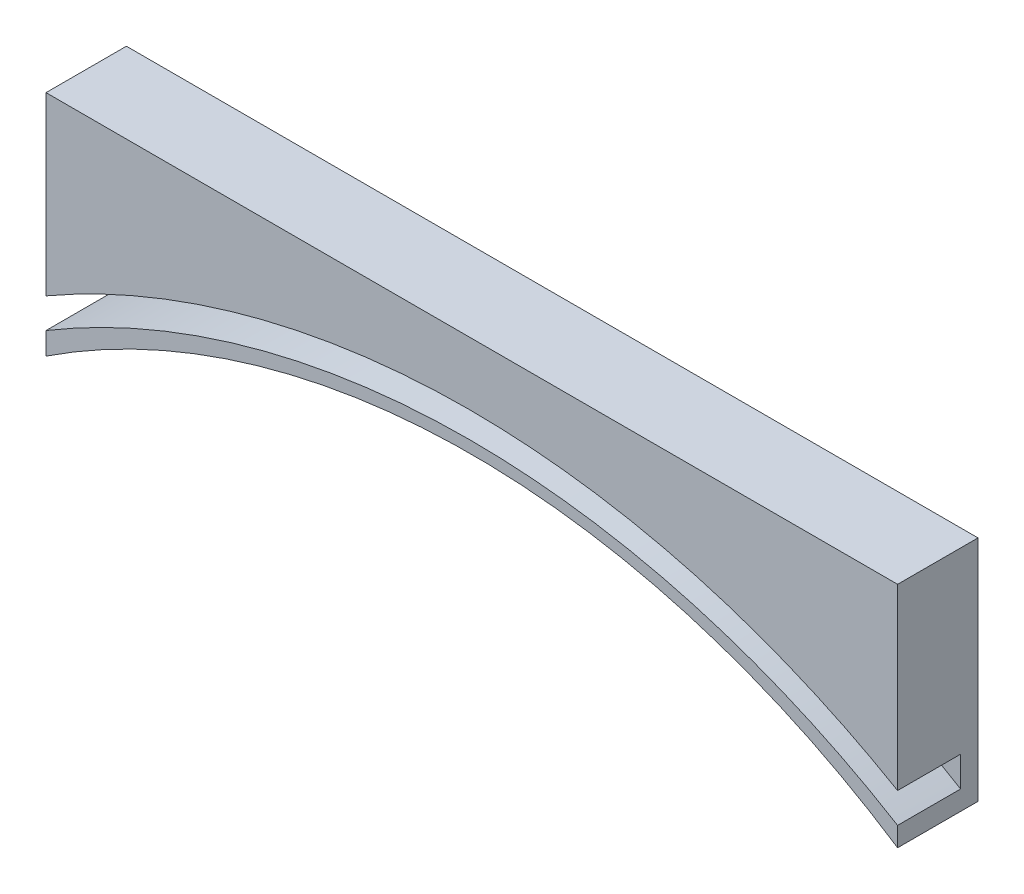
ISO-10303-21;
HEADER;
FILE_DESCRIPTION(('STEP AP214'),'2;1');
FILE_NAME('part.step','',(''),(''),'','','');
FILE_SCHEMA(('AUTOMOTIVE_DESIGN { 1 0 10303 214 1 1 1 1 }'));
ENDSEC;
DATA;
#1=APPLICATION_CONTEXT('core data for automotive mechanical design processes');
#2=APPLICATION_PROTOCOL_DEFINITION('international standard','automotive_design',2000,#1);
#3=PRODUCT_CONTEXT('',#1,'mechanical');
#4=PRODUCT('Part','Part','',(#3));
#5=PRODUCT_RELATED_PRODUCT_CATEGORY('part','',(#4));
#6=PRODUCT_DEFINITION_FORMATION('','',#4);
#7=PRODUCT_DEFINITION_CONTEXT('part definition',#1,'design');
#8=PRODUCT_DEFINITION('design','',#6,#7);
#9=PRODUCT_DEFINITION_SHAPE('','',#8);
#10=(LENGTH_UNIT() NAMED_UNIT(*) SI_UNIT(.MILLI.,.METRE.));
#11=(NAMED_UNIT(*) PLANE_ANGLE_UNIT() SI_UNIT($,.RADIAN.));
#12=(NAMED_UNIT(*) SI_UNIT($,.STERADIAN.) SOLID_ANGLE_UNIT());
#13=UNCERTAINTY_MEASURE_WITH_UNIT(LENGTH_MEASURE(1.E-05),#10,'distance_accuracy_value','');
#14=(GEOMETRIC_REPRESENTATION_CONTEXT(3) GLOBAL_UNCERTAINTY_ASSIGNED_CONTEXT((#13)) GLOBAL_UNIT_ASSIGNED_CONTEXT((#10,
#11,#12)) REPRESENTATION_CONTEXT('',''));
#15=CARTESIAN_POINT('',(0.,0.,0.));
#16=DIRECTION('',(0.,0.,1.));
#17=DIRECTION('',(1.,0.,0.));
#18=AXIS2_PLACEMENT_3D('',#15,#16,#17);
#19=CARTESIAN_POINT('',(0.,0.,16.));
#20=DIRECTION('',(0.,0.,-1.));
#21=DIRECTION('',(-1.,0.,0.));
#22=AXIS2_PLACEMENT_3D('',#19,#20,#21);
#23=PLANE('',#22);
#24=CARTESIAN_POINT('',(82.7397911109106,-124.333714197072,16.002903079481));
#25=CARTESIAN_POINT('',(82.3755164084784,-124.117363235297,16.002903079481));
#26=CARTESIAN_POINT('',(82.0018327999817,-123.896841508316,16.0029030794832));
#27=CARTESIAN_POINT('',(68.6213010314857,-116.090106708364,16.0029030794038));
#28=CARTESIAN_POINT('',(54.2566697477969,-110.065617593653,16.0029030794813));
#29=CARTESIAN_POINT('',(24.0296779465722,-102.175579117723,16.0029030794813));
#30=CARTESIAN_POINT('',(8.21085486277685,-100.312946686678,16.0029030794819));
#31=CARTESIAN_POINT('',(-23.2222044888509,-101.051424681224,16.0029030794819));
#32=CARTESIAN_POINT('',(-38.7982289385683,-103.637289837195,16.0029030795092));
#33=CARTESIAN_POINT('',(-60.8099606073978,-110.444286670569,16.0029030794699));
#34=CARTESIAN_POINT('',(-67.9191228027658,-113.18910098956,16.0029030794836));
#35=CARTESIAN_POINT('',(-81.5489054987576,-119.52157367615,16.0029030794836));
#36=CARTESIAN_POINT('',(-88.0575222460823,-123.118344791084,16.0029030794967));
#37=CARTESIAN_POINT('',(-94.2179272228485,-127.000728785435,16.0029030794842));
#38=B_SPLINE_CURVE_WITH_KNOTS('',3,(#24,#25,#26,#27,#28,#29,#30,#31,#32,#33,#34,#35,#36,#37),
.UNSPECIFIED.,.F.,.F.,(4,2,2,2,2,2,4),(0.,0.00683637442183873,0.255127280816379,
0.503418187210919,0.75170909360546,0.87585454680273,1.),.UNSPECIFIED.);
#39=CARTESIAN_POINT('',(81.6432889200797,-123.687662359794,16.0014515397465));
#40=VERTEX_POINT('',#39);
#41=CARTESIAN_POINT('',(-87.8567110799016,-123.169281222685,16.0011965057749));
#42=VERTEX_POINT('',#41);
#43=EDGE_CURVE('E176',#40,#42,#38,.T.);
#44=ORIENTED_EDGE('',*,*,#43,.F.);
#45=DIRECTION('',(0.,1.,0.));
#46=VECTOR('',#45,1.);
#47=CARTESIAN_POINT('',(81.6432889200797,-98.1371131385497,16.));
#48=LINE('',#47,#46);
#49=CARTESIAN_POINT('',(81.6432889200797,-88.1371131385497,16.));
#50=VERTEX_POINT('',#49);
#51=EDGE_CURVE('E115',#50,#40,#48,.F.);
#52=ORIENTED_EDGE('',*,*,#51,.F.);
#53=DIRECTION('',(1.,0.,0.));
#54=VECTOR('',#53,1.);
#55=CARTESIAN_POINT('',(-87.8567110799203,-88.1371131385497,16.));
#56=LINE('',#55,#54);
#57=CARTESIAN_POINT('',(-87.8567110799203,-88.1371131385497,16.));
#58=VERTEX_POINT('',#57);
#59=EDGE_CURVE('E118',#58,#50,#56,.T.);
#60=ORIENTED_EDGE('',*,*,#59,.F.);
#61=DIRECTION('',(0.,1.,0.));
#62=VECTOR('',#61,1.);
#63=CARTESIAN_POINT('',(-87.8567110799203,-98.1371131385497,15.9999999999999));
#64=LINE('',#63,#62);
#65=EDGE_CURVE('E52',#42,#58,#64,.T.);
#66=ORIENTED_EDGE('',*,*,#65,.F.);
#67=EDGE_LOOP('',(#44,#52,#60,#66));
#68=FACE_BOUND('',#67,.T.);
#69=ADVANCED_FACE('F41',(#68),#23,.F.);
#70=DIRECTION('',(0.,1.,0.));
#71=VECTOR('',#70,1.);
#72=CARTESIAN_POINT('',(81.6432889200797,-98.1371131385497,16.));
#73=LINE('',#72,#71);
#74=CARTESIAN_POINT('',(81.643288919573,-129.687642387889,16.0011950243792));
#75=VERTEX_POINT('',#74);
#76=CARTESIAN_POINT('',(81.6432889200797,-133.554697933359,16.));
#77=VERTEX_POINT('',#76);
#78=EDGE_CURVE('E157',#75,#77,#73,.F.);
#79=ORIENTED_EDGE('',*,*,#78,.F.);
#80=CARTESIAN_POINT('',(82.6962099718894,-130.333555918678,16.002903079481));
#81=CARTESIAN_POINT('',(82.3464719936446,-130.117236358512,16.002903079481));
#82=CARTESIAN_POINT('',(81.9866255242221,-129.896841506799,16.0029030794796));
#83=CARTESIAN_POINT('',(69.1736154673486,-122.090106763448,16.0029030795325));
#84=CARTESIAN_POINT('',(55.3321985254833,-115.995213643004,16.0029030794808));
#85=CARTESIAN_POINT('',(26.1893467667422,-107.801652521192,16.0029030794808));
#86=CARTESIAN_POINT('',(10.8735078417722,-105.719561422908,16.0029030794802));
#87=CARTESIAN_POINT('',(-19.5942812305018,-105.863843686113,16.0029030794802));
#88=CARTESIAN_POINT('',(-34.7499351591748,-108.099853972977,16.0029030795054));
#89=CARTESIAN_POINT('',(-56.2032333443861,-114.298356521092,16.002903079466));
#90=CARTESIAN_POINT('',(-63.1487154455918,-116.838422053478,16.0029030794657));
#91=CARTESIAN_POINT('',(-76.4671950944512,-122.723221566616,16.0029030794913));
#92=CARTESIAN_POINT('',(-82.8399146507995,-126.093721607834,16.0029030794903));
#93=CARTESIAN_POINT('',(-88.8939086785165,-129.767464504583,16.0029030794779));
#94=B_SPLINE_CURVE_WITH_KNOTS('',3,(#80,#81,#82,#83,#84,#85,#86,#87,#88,#89,#90,#91,#92,#93),
.UNSPECIFIED.,.F.,.F.,(4,2,2,2,2,2,4),(0.,0.00683637442183873,0.255127280816379,
0.503418187210919,0.75170909360546,0.87585454680273,1.),.UNSPECIFIED.);
#95=CARTESIAN_POINT('',(-87.8567110799203,-129.142909702766,16.00145153964));
#96=VERTEX_POINT('',#95);
#97=EDGE_CURVE('E166',#75,#96,#94,.T.);
#98=ORIENTED_EDGE('',*,*,#97,.T.);
#99=DIRECTION('',(0.,1.,0.));
#100=VECTOR('',#99,1.);
#101=CARTESIAN_POINT('',(-87.8567110799203,-98.1371131385497,15.9999999999999));
#102=LINE('',#101,#100);
#103=CARTESIAN_POINT('',(-87.8567110799203,-133.554697933359,15.9999999999999));
#104=VERTEX_POINT('',#103);
#105=EDGE_CURVE('E12',#104,#96,#102,.T.);
#106=ORIENTED_EDGE('',*,*,#105,.F.);
#107=CARTESIAN_POINT('',(-3.10671107992024,-262.13711313855,16.));
#108=DIRECTION('',(0.,0.,-1.));
#109=DIRECTION('',(-1.,0.,0.));
#110=AXIS2_PLACEMENT_3D('',#107,#108,#109);
#111=CIRCLE('',#110,154.);
#112=EDGE_CURVE('E155',#77,#104,#111,.F.);
#113=ORIENTED_EDGE('',*,*,#112,.F.);
#114=EDGE_LOOP('',(#79,#98,#106,#113));
#115=FACE_BOUND('',#114,.T.);
#116=ADVANCED_FACE('F43',(#115),#23,.F.);
#117=CARTESIAN_POINT('',(0.,0.,0.));
#118=DIRECTION('',(0.,0.,1.));
#119=DIRECTION('',(1.,0.,0.));
#120=AXIS2_PLACEMENT_3D('',#117,#118,#119);
#121=PLANE('',#120);
#122=DIRECTION('',(0.,1.,0.));
#123=VECTOR('',#122,1.);
#124=CARTESIAN_POINT('',(81.6432889200797,-98.1371131385497,0.));
#125=LINE('',#124,#123);
#126=CARTESIAN_POINT('',(81.6432889200797,-133.554697933359,0.));
#127=VERTEX_POINT('',#126);
#128=CARTESIAN_POINT('',(81.6432889200797,-88.1371131385497,0.));
#129=VERTEX_POINT('',#128);
#130=EDGE_CURVE('E152',#127,#129,#125,.T.);
#131=ORIENTED_EDGE('',*,*,#130,.F.);
#132=CARTESIAN_POINT('',(-3.10671107992024,-262.13711313855,0.));
#133=DIRECTION('',(0.,0.,1.));
#134=DIRECTION('',(1.,0.,0.));
#135=AXIS2_PLACEMENT_3D('',#132,#133,#134);
#136=CIRCLE('',#135,154.);
#137=CARTESIAN_POINT('',(-87.8567110799202,-133.554697933359,0.));
#138=VERTEX_POINT('',#137);
#139=EDGE_CURVE('E146',#138,#127,#136,.F.);
#140=ORIENTED_EDGE('',*,*,#139,.F.);
#141=DIRECTION('',(0.,-1.,0.));
#142=VECTOR('',#141,1.);
#143=CARTESIAN_POINT('',(-87.8567110799203,-98.1371131385497,0.));
#144=LINE('',#143,#142);
#145=CARTESIAN_POINT('',(-87.8567110799203,-88.1371131385497,0.));
#146=VERTEX_POINT('',#145);
#147=EDGE_CURVE('E150',#146,#138,#144,.T.);
#148=ORIENTED_EDGE('',*,*,#147,.F.);
#149=DIRECTION('',(-1.,0.,0.));
#150=VECTOR('',#149,1.);
#151=CARTESIAN_POINT('',(-87.8567110799203,-88.1371131385497,0.));
#152=LINE('',#151,#150);
#153=EDGE_CURVE('E128',#129,#146,#152,.T.);
#154=ORIENTED_EDGE('',*,*,#153,.F.);
#155=EDGE_LOOP('',(#131,#140,#148,#154));
#156=FACE_BOUND('',#155,.T.);
#157=ADVANCED_FACE('F229',(#156),#121,.F.);
#158=CARTESIAN_POINT('',(-87.8567110799203,-98.1371131385497,32.));
#159=DIRECTION('',(1.,0.,0.));
#160=DIRECTION('',(0.,1.,0.));
#161=AXIS2_PLACEMENT_3D('',#158,#159,#160);
#162=PLANE('',#161);
#163=DIRECTION('',(0.,-1.,-1.98370607513062E-12));
#164=VECTOR('',#163,1.);
#165=CARTESIAN_POINT('',(-87.8567110799203,-130.333555918678,3.46290307927768));
#166=LINE('',#165,#164);
#167=CARTESIAN_POINT('',(-87.8567110799203,-129.142908170963,3.46290307928005));
#168=VERTEX_POINT('',#167);
#169=CARTESIAN_POINT('',(-87.856711079882,-123.169267995206,3.46290307934264));
#170=VERTEX_POINT('',#169);
#171=EDGE_CURVE('E141',#168,#170,#166,.F.);
#172=ORIENTED_EDGE('',*,*,#171,.T.);
#173=DIRECTION('',(0.,0.,1.));
#174=VECTOR('',#173,1.);
#175=CARTESIAN_POINT('',(-87.8567110799203,-123.169291290547,9.73290307949224));
#176=LINE('',#175,#174);
#177=EDGE_CURVE('E112',#170,#42,#176,.T.);
#178=ORIENTED_EDGE('',*,*,#177,.T.);
#179=ORIENTED_EDGE('',*,*,#65,.T.);
#180=DIRECTION('',(0.,0.,1.));
#181=VECTOR('',#180,1.);
#182=CARTESIAN_POINT('',(-87.8567110799203,-88.1371131385497,0.));
#183=LINE('',#182,#181);
#184=EDGE_CURVE('E111',#146,#58,#183,.T.);
#185=ORIENTED_EDGE('',*,*,#184,.F.);
#186=ORIENTED_EDGE('',*,*,#147,.T.);
#187=DIRECTION('',(0.,0.,1.));
#188=VECTOR('',#187,1.);
#189=CARTESIAN_POINT('',(-87.8567110799203,-133.554697933359,-435.577777210913));
#190=LINE('',#189,#188);
#191=EDGE_CURVE('E153',#138,#104,#190,.T.);
#192=ORIENTED_EDGE('',*,*,#191,.T.);
#193=ORIENTED_EDGE('',*,*,#105,.T.);
#194=DIRECTION('',(0.,0.,-1.));
#195=VECTOR('',#194,1.);
#196=CARTESIAN_POINT('',(-87.8567110799203,-129.142912059641,9.73290307947997));
#197=LINE('',#196,#195);
#198=EDGE_CURVE('E140',#96,#168,#197,.T.);
#199=ORIENTED_EDGE('',*,*,#198,.T.);
#200=EDGE_LOOP('',(#172,#178,#179,#185,#186,#192,#193,#199));
#201=FACE_BOUND('',#200,.T.);
#202=ADVANCED_FACE('F108',(#201),#162,.F.);
#203=CARTESIAN_POINT('',(81.6432889200797,-98.1371131385497,32.));
#204=DIRECTION('',(-1.,0.,0.));
#205=DIRECTION('',(0.,0.,1.));
#206=AXIS2_PLACEMENT_3D('',#203,#204,#205);
#207=PLANE('',#206);
#208=ORIENTED_EDGE('',*,*,#51,.T.);
#209=DIRECTION('',(0.,0.,1.));
#210=VECTOR('',#209,1.);
#211=CARTESIAN_POINT('',(81.6432889200792,-123.68765273817,9.73290307948105));
#212=LINE('',#211,#210);
#213=CARTESIAN_POINT('',(81.6432889200795,-123.687659651613,3.46290307948701));
#214=VERTEX_POINT('',#213);
#215=EDGE_CURVE('E311',#40,#214,#212,.F.);
#216=ORIENTED_EDGE('',*,*,#215,.T.);
#217=DIRECTION('',(0.,1.,1.98370607513062E-12));
#218=VECTOR('',#217,1.);
#219=CARTESIAN_POINT('',(81.6432889200797,-130.333555918678,3.46290307947979));
#220=LINE('',#219,#218);
#221=CARTESIAN_POINT('',(81.6432889194299,-129.68763762953,3.46290307948106));
#222=VERTEX_POINT('',#221);
#223=EDGE_CURVE('E306',#214,#222,#220,.F.);
#224=ORIENTED_EDGE('',*,*,#223,.T.);
#225=DIRECTION('',(0.,0.,-1.));
#226=VECTOR('',#225,1.);
#227=CARTESIAN_POINT('',(81.6432889200798,-129.68765273817,9.73290307948105));
#228=LINE('',#227,#226);
#229=EDGE_CURVE('E302',#222,#75,#228,.F.);
#230=ORIENTED_EDGE('',*,*,#229,.T.);
#231=ORIENTED_EDGE('',*,*,#78,.T.);
#232=DIRECTION('',(0.,0.,1.));
#233=VECTOR('',#232,1.);
#234=CARTESIAN_POINT('',(81.6432889200797,-133.554697933359,-435.577777210913));
#235=LINE('',#234,#233);
#236=EDGE_CURVE('E149',#77,#127,#235,.F.);
#237=ORIENTED_EDGE('',*,*,#236,.T.);
#238=ORIENTED_EDGE('',*,*,#130,.T.);
#239=DIRECTION('',(0.,0.,-1.));
#240=VECTOR('',#239,1.);
#241=CARTESIAN_POINT('',(81.6432889200797,-88.1371131385497,0.));
#242=LINE('',#241,#240);
#243=EDGE_CURVE('E123',#50,#129,#242,.T.);
#244=ORIENTED_EDGE('',*,*,#243,.F.);
#245=EDGE_LOOP('',(#208,#216,#224,#230,#231,#237,#238,#244));
#246=FACE_BOUND('',#245,.T.);
#247=ADVANCED_FACE('F274',(#246),#207,.F.);
#248=CARTESIAN_POINT('',(-3.10671107992024,-262.13711313855,-435.577777210913));
#249=DIRECTION('',(0.,0.,1.));
#250=DIRECTION('',(1.,0.,0.));
#251=AXIS2_PLACEMENT_3D('',#248,#249,#250);
#252=CYLINDRICAL_SURFACE('',#251,154.);
#253=ORIENTED_EDGE('',*,*,#236,.F.);
#254=ORIENTED_EDGE('',*,*,#112,.T.);
#255=ORIENTED_EDGE('',*,*,#191,.F.);
#256=ORIENTED_EDGE('',*,*,#139,.T.);
#257=EDGE_LOOP('',(#253,#254,#255,#256));
#258=FACE_BOUND('',#257,.T.);
#259=ADVANCED_FACE('F228',(#258),#252,.F.);
#260=CARTESIAN_POINT('',(82.6962099718894,-130.333555918678,3.46290307948104));
#261=DIRECTION('',(1.19235148299765E-12,1.98370607513062E-12,-1.));
#262=DIRECTION('',(0.,1.,1.98370607513062E-12));
#263=AXIS2_PLACEMENT_3D('',#260,#261,#262);
#264=PLANE('',#263);
#265=CARTESIAN_POINT('',(82.6962099718894,-130.333555918678,3.46290307948104));
#266=CARTESIAN_POINT('',(82.3464719936526,-130.117236358517,3.46290307948104));
#267=CARTESIAN_POINT('',(81.9866255242108,-129.896841506793,3.46290307947963));
#268=CARTESIAN_POINT('',(69.1736154677605,-122.090106763654,3.46290307953253));
#269=CARTESIAN_POINT('',(55.3321985254836,-115.995213643003,3.46290307948417));
#270=CARTESIAN_POINT('',(26.1893467667425,-107.801652521191,3.4629030794775));
#271=CARTESIAN_POINT('',(10.8735078417721,-105.719561422904,3.46290307948688));
#272=CARTESIAN_POINT('',(-19.5942812305018,-105.863843686109,3.46290307947346));
#273=CARTESIAN_POINT('',(-34.7499351591775,-108.099853972968,3.46290307948897));
#274=CARTESIAN_POINT('',(-56.2032333443888,-114.298356521083,3.46290307947421));
#275=CARTESIAN_POINT('',(-63.148715445597,-116.838422053466,3.46290307947049));
#276=CARTESIAN_POINT('',(-76.4671950944563,-122.723221566604,3.46290307948653));
#277=CARTESIAN_POINT('',(-82.8399146506748,-126.093721608039,3.46290307949188));
#278=CARTESIAN_POINT('',(-88.8939086785247,-129.76746450457,3.46290307947786));
#279=B_SPLINE_CURVE_WITH_KNOTS('',3,(#265,#266,#267,#268,#269,#270,#271,#272,#273,#274,#275,
#276,#277,#278),.UNSPECIFIED.,.F.,.F.,(4,2,2,2,2,2,4),(0.,0.00683637442183873,0.255127280816379,
0.503418187210919,0.75170909360546,0.87585454680273,1.),.UNSPECIFIED.);
#280=EDGE_CURVE('E61',#222,#168,#279,.T.);
#281=ORIENTED_EDGE('',*,*,#280,.F.);
#282=ORIENTED_EDGE('',*,*,#223,.F.);
#283=CARTESIAN_POINT('',(82.7397911109106,-124.333714197072,3.46290307948104));
#284=CARTESIAN_POINT('',(82.3755164084866,-124.117363235302,3.46290307948104));
#285=CARTESIAN_POINT('',(82.0018327999704,-123.89684150831,3.46290307948317));
#286=CARTESIAN_POINT('',(68.6213010318975,-116.09010670857,3.46290307940383));
#287=CARTESIAN_POINT('',(54.2566697477971,-110.065617593652,3.46290307948462));
#288=CARTESIAN_POINT('',(24.0296779465725,-102.175579117722,3.46290307947795));
#289=CARTESIAN_POINT('',(8.2108548627768,-100.312946686673,3.46290307948866));
#290=CARTESIAN_POINT('',(-23.222204488851,-101.051424681219,3.46290307947524));
#291=CARTESIAN_POINT('',(-38.7982289385709,-103.637289837186,3.46290307948954));
#292=CARTESIAN_POINT('',(-60.8099606074004,-110.44428667056,3.4629030794797));
#293=CARTESIAN_POINT('',(-67.9191228027709,-113.189100989549,3.46290307947557));
#294=CARTESIAN_POINT('',(-81.5489054987627,-119.521573676139,3.46290307949161));
#295=CARTESIAN_POINT('',(-88.0575222460453,-123.118344791142,3.46290307950447));
#296=CARTESIAN_POINT('',(-94.2179272228566,-127.000728785422,3.46290307948423));
#297=B_SPLINE_CURVE_WITH_KNOTS('',3,(#283,#284,#285,#286,#287,#288,#289,#290,#291,#292,#293,
#294,#295,#296),.UNSPECIFIED.,.F.,.F.,(4,2,2,2,2,2,4),(0.,0.00683637442183873,0.255127280816379,
0.503418187210919,0.75170909360546,0.87585454680273,1.),.UNSPECIFIED.);
#298=EDGE_CURVE('E187',#214,#170,#297,.T.);
#299=ORIENTED_EDGE('',*,*,#298,.T.);
#300=ORIENTED_EDGE('',*,*,#171,.F.);
#301=EDGE_LOOP('',(#281,#282,#299,#300));
#302=FACE_BOUND('',#301,.T.);
#303=ADVANCED_FACE('F217',(#302),#264,.F.);
#304=CARTESIAN_POINT('',(82.7397911109106,-124.333714197072,3.46290307948104));
#305=CARTESIAN_POINT('',(82.3755164084866,-124.117363235302,3.46290307948104));
#306=CARTESIAN_POINT('',(82.0018327999704,-123.89684150831,3.46290307948317));
#307=CARTESIAN_POINT('',(68.6213010318975,-116.09010670857,3.46290307940383));
#308=CARTESIAN_POINT('',(54.2566697477971,-110.065617593652,3.46290307948462));
#309=CARTESIAN_POINT('',(24.0296779465725,-102.175579117722,3.46290307947795));
#310=CARTESIAN_POINT('',(8.2108548627768,-100.312946686673,3.46290307948866));
#311=CARTESIAN_POINT('',(-23.222204488851,-101.051424681219,3.46290307947524));
#312=CARTESIAN_POINT('',(-38.7982289385709,-103.637289837186,3.46290307948954));
#313=CARTESIAN_POINT('',(-60.8099606074004,-110.44428667056,3.4629030794797));
#314=CARTESIAN_POINT('',(-67.9191228027709,-113.189100989549,3.46290307947557));
#315=CARTESIAN_POINT('',(-81.5489054987627,-119.521573676139,3.46290307949161));
#316=CARTESIAN_POINT('',(-88.0575222460453,-123.118344791142,3.46290307950447));
#317=CARTESIAN_POINT('',(-94.2179272228566,-127.000728785422,3.46290307948423));
#318=CARTESIAN_POINT('',(82.7397911109106,-124.333714197072,16.002903079481));
#319=CARTESIAN_POINT('',(82.3755164084784,-124.117363235297,16.002903079481));
#320=CARTESIAN_POINT('',(82.0018327999817,-123.896841508316,16.0029030794832));
#321=CARTESIAN_POINT('',(68.6213010314857,-116.090106708364,16.0029030794038));
#322=CARTESIAN_POINT('',(54.2566697477969,-110.065617593653,16.0029030794813));
#323=CARTESIAN_POINT('',(24.0296779465722,-102.175579117723,16.0029030794813));
#324=CARTESIAN_POINT('',(8.21085486277685,-100.312946686678,16.0029030794819));
#325=CARTESIAN_POINT('',(-23.2222044888509,-101.051424681224,16.0029030794819));
#326=CARTESIAN_POINT('',(-38.7982289385683,-103.637289837195,16.0029030795092));
#327=CARTESIAN_POINT('',(-60.8099606073978,-110.444286670569,16.0029030794699));
#328=CARTESIAN_POINT('',(-67.9191228027658,-113.18910098956,16.0029030794836));
#329=CARTESIAN_POINT('',(-81.5489054987576,-119.52157367615,16.0029030794836));
#330=CARTESIAN_POINT('',(-88.0575222460823,-123.118344791084,16.0029030794967));
#331=CARTESIAN_POINT('',(-94.2179272228485,-127.000728785435,16.0029030794842));
#332=B_SPLINE_SURFACE_WITH_KNOTS('',1,3,((#304,#305,#306,#307,#308,#309,#310,#311,#312,#313,
#314,#315,#316,#317),(#318,#319,#320,#321,#322,#323,#324,#325,#326,#327,#328,#329,#330,#331)),
.UNSPECIFIED.,.F.,.F.,.F.,(2,2),(4,2,2,2,2,2,4),(0.,1.),(0.,0.00683637442183873,
0.255127280816379,0.503418187210919,0.75170909360546,0.87585454680273,1.),.UNSPECIFIED.);
#333=ORIENTED_EDGE('',*,*,#298,.F.);
#334=ORIENTED_EDGE('',*,*,#215,.F.);
#335=ORIENTED_EDGE('',*,*,#43,.T.);
#336=ORIENTED_EDGE('',*,*,#177,.F.);
#337=EDGE_LOOP('',(#333,#334,#335,#336));
#338=FACE_BOUND('',#337,.T.);
#339=ADVANCED_FACE('F227',(#338),#332,.T.);
#340=CARTESIAN_POINT('',(82.6962099718894,-130.333555918678,16.002903079481));
#341=CARTESIAN_POINT('',(82.3464719936446,-130.117236358512,16.002903079481));
#342=CARTESIAN_POINT('',(81.9866255242221,-129.896841506799,16.0029030794796));
#343=CARTESIAN_POINT('',(69.1736154673486,-122.090106763448,16.0029030795325));
#344=CARTESIAN_POINT('',(55.3321985254833,-115.995213643004,16.0029030794808));
#345=CARTESIAN_POINT('',(26.1893467667422,-107.801652521192,16.0029030794808));
#346=CARTESIAN_POINT('',(10.8735078417722,-105.719561422908,16.0029030794802));
#347=CARTESIAN_POINT('',(-19.5942812305018,-105.863843686113,16.0029030794802));
#348=CARTESIAN_POINT('',(-34.7499351591748,-108.099853972977,16.0029030795054));
#349=CARTESIAN_POINT('',(-56.2032333443861,-114.298356521092,16.002903079466));
#350=CARTESIAN_POINT('',(-63.1487154455918,-116.838422053478,16.0029030794657));
#351=CARTESIAN_POINT('',(-76.4671950944512,-122.723221566616,16.0029030794913));
#352=CARTESIAN_POINT('',(-82.8399146507995,-126.093721607834,16.0029030794903));
#353=CARTESIAN_POINT('',(-88.8939086785165,-129.767464504583,16.0029030794779));
#354=CARTESIAN_POINT('',(82.6962099718894,-130.333555918678,3.46290307948104));
#355=CARTESIAN_POINT('',(82.3464719936526,-130.117236358517,3.46290307948104));
#356=CARTESIAN_POINT('',(81.9866255242108,-129.896841506793,3.46290307947963));
#357=CARTESIAN_POINT('',(69.1736154677605,-122.090106763654,3.46290307953253));
#358=CARTESIAN_POINT('',(55.3321985254836,-115.995213643003,3.46290307948417));
#359=CARTESIAN_POINT('',(26.1893467667425,-107.801652521191,3.4629030794775));
#360=CARTESIAN_POINT('',(10.8735078417721,-105.719561422904,3.46290307948688));
#361=CARTESIAN_POINT('',(-19.5942812305018,-105.863843686109,3.46290307947346));
#362=CARTESIAN_POINT('',(-34.7499351591775,-108.099853972968,3.46290307948897));
#363=CARTESIAN_POINT('',(-56.2032333443888,-114.298356521083,3.46290307947421));
#364=CARTESIAN_POINT('',(-63.148715445597,-116.838422053466,3.46290307947049));
#365=CARTESIAN_POINT('',(-76.4671950944563,-122.723221566604,3.46290307948653));
#366=CARTESIAN_POINT('',(-82.8399146506748,-126.093721608039,3.46290307949188));
#367=CARTESIAN_POINT('',(-88.8939086785247,-129.76746450457,3.46290307947786));
#368=B_SPLINE_SURFACE_WITH_KNOTS('',1,3,((#340,#341,#342,#343,#344,#345,#346,#347,#348,#349,
#350,#351,#352,#353),(#354,#355,#356,#357,#358,#359,#360,#361,#362,#363,#364,#365,#366,#367)),
.UNSPECIFIED.,.F.,.F.,.F.,(2,2),(4,2,2,2,2,2,4),(0.,1.),(0.,0.00683637442183873,
0.255127280816379,0.503418187210919,0.75170909360546,0.87585454680273,1.),.UNSPECIFIED.);
#369=ORIENTED_EDGE('',*,*,#97,.F.);
#370=ORIENTED_EDGE('',*,*,#229,.F.);
#371=ORIENTED_EDGE('',*,*,#280,.T.);
#372=ORIENTED_EDGE('',*,*,#198,.F.);
#373=EDGE_LOOP('',(#369,#370,#371,#372));
#374=FACE_BOUND('',#373,.T.);
#375=ADVANCED_FACE('F255',(#374),#368,.T.);
#376=CARTESIAN_POINT('',(0.,-88.1371131385497,0.));
#377=DIRECTION('',(0.,1.,0.));
#378=DIRECTION('',(0.,0.,1.));
#379=AXIS2_PLACEMENT_3D('',#376,#377,#378);
#380=PLANE('',#379);
#381=ORIENTED_EDGE('',*,*,#184,.T.);
#382=ORIENTED_EDGE('',*,*,#59,.T.);
#383=ORIENTED_EDGE('',*,*,#243,.T.);
#384=ORIENTED_EDGE('',*,*,#153,.T.);
#385=EDGE_LOOP('',(#381,#382,#383,#384));
#386=FACE_BOUND('',#385,.T.);
#387=ADVANCED_FACE('F126',(#386),#380,.T.);
#388=CLOSED_SHELL('',(#69,#116,#157,#202,#247,#259,#303,#339,#375,#387));
#389=MANIFOLD_SOLID_BREP('B2',#388);
#390=ADVANCED_BREP_SHAPE_REPRESENTATION('',(#18,#389),#14);
#391=SHAPE_DEFINITION_REPRESENTATION(#9,#390);
ENDSEC;
END-ISO-10303-21;
